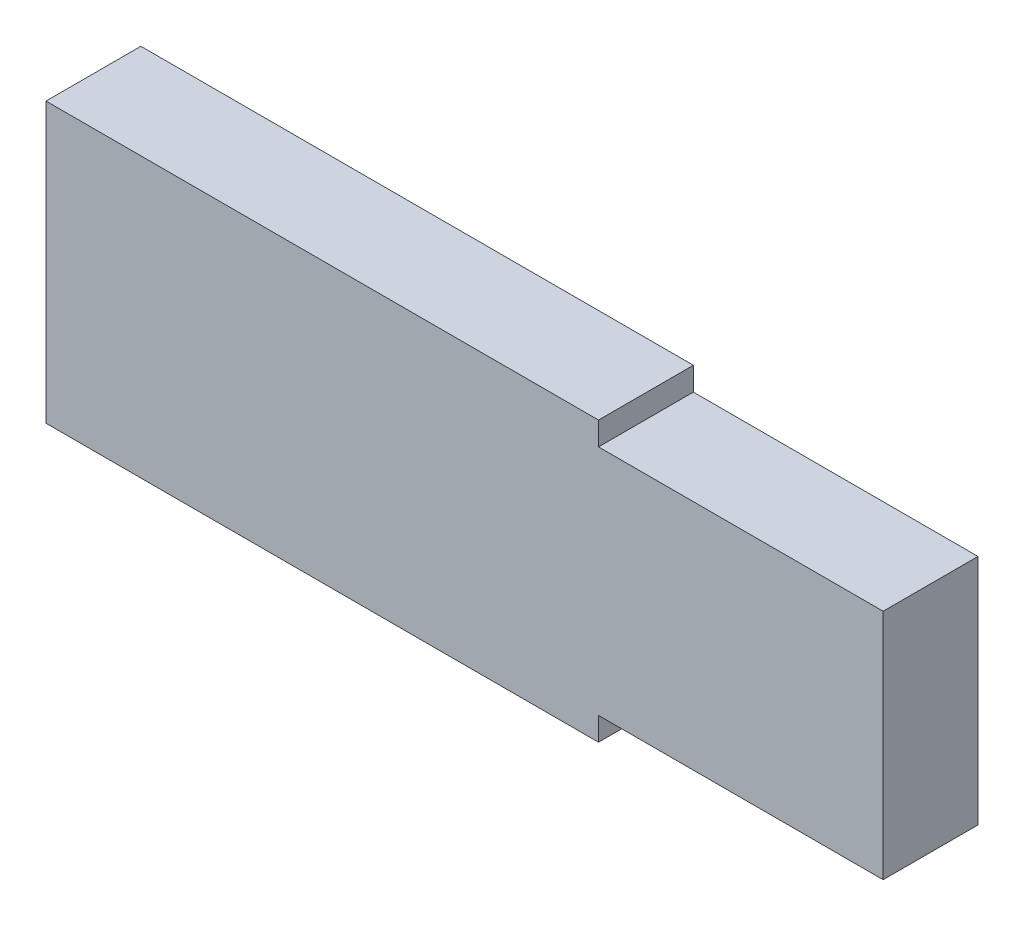
ISO-10303-21;
HEADER;
FILE_DESCRIPTION(('STEP AP214'),'2;1');
FILE_NAME('part.step','',(''),(''),'','','');
FILE_SCHEMA(('AUTOMOTIVE_DESIGN { 1 0 10303 214 1 1 1 1 }'));
ENDSEC;
DATA;
#1=APPLICATION_CONTEXT('core data for automotive mechanical design processes');
#2=APPLICATION_PROTOCOL_DEFINITION('international standard','automotive_design',2000,#1);
#3=PRODUCT_CONTEXT('',#1,'mechanical');
#4=PRODUCT('Part','Part','',(#3));
#5=PRODUCT_RELATED_PRODUCT_CATEGORY('part','',(#4));
#6=PRODUCT_DEFINITION_FORMATION('','',#4);
#7=PRODUCT_DEFINITION_CONTEXT('part definition',#1,'design');
#8=PRODUCT_DEFINITION('design','',#6,#7);
#9=PRODUCT_DEFINITION_SHAPE('','',#8);
#10=(LENGTH_UNIT() NAMED_UNIT(*) SI_UNIT(.MILLI.,.METRE.));
#11=(NAMED_UNIT(*) PLANE_ANGLE_UNIT() SI_UNIT($,.RADIAN.));
#12=(NAMED_UNIT(*) SI_UNIT($,.STERADIAN.) SOLID_ANGLE_UNIT());
#13=UNCERTAINTY_MEASURE_WITH_UNIT(LENGTH_MEASURE(1.E-05),#10,'distance_accuracy_value','');
#14=(GEOMETRIC_REPRESENTATION_CONTEXT(3) GLOBAL_UNCERTAINTY_ASSIGNED_CONTEXT((#13)) GLOBAL_UNIT_ASSIGNED_CONTEXT((#10,
#11,#12)) REPRESENTATION_CONTEXT('',''));
#15=CARTESIAN_POINT('',(0.,0.,0.));
#16=DIRECTION('',(0.,0.,1.));
#17=DIRECTION('',(1.,0.,0.));
#18=AXIS2_PLACEMENT_3D('',#15,#16,#17);
#19=CARTESIAN_POINT('',(80.,-7.49999999999999,5.1));
#20=DIRECTION('',(-1.,0.,0.));
#21=DIRECTION('',(0.,0.,1.));
#22=AXIS2_PLACEMENT_3D('',#19,#20,#21);
#23=PLANE('',#22);
#24=DIRECTION('',(0.,1.,0.));
#25=VECTOR('',#24,1.);
#26=CARTESIAN_POINT('',(80.,-7.49999999999999,0.));
#27=LINE('',#26,#25);
#28=CARTESIAN_POINT('',(80.,-7.49999999999999,0.));
#29=VERTEX_POINT('',#28);
#30=CARTESIAN_POINT('',(80.,-6.25,0.));
#31=VERTEX_POINT('',#30);
#32=EDGE_CURVE('E129',#29,#31,#27,.T.);
#33=ORIENTED_EDGE('',*,*,#32,.T.);
#34=DIRECTION('',(0.,0.,-1.));
#35=VECTOR('',#34,1.);
#36=CARTESIAN_POINT('',(80.,-6.25,5.1));
#37=LINE('',#36,#35);
#38=CARTESIAN_POINT('',(80.,-6.25,5.1));
#39=VERTEX_POINT('',#38);
#40=EDGE_CURVE('E11',#39,#31,#37,.T.);
#41=ORIENTED_EDGE('',*,*,#40,.F.);
#42=DIRECTION('',(0.,1.,0.));
#43=VECTOR('',#42,1.);
#44=CARTESIAN_POINT('',(80.,-7.49999999999999,5.1));
#45=LINE('',#44,#43);
#46=CARTESIAN_POINT('',(80.,-7.49999999999999,5.1));
#47=VERTEX_POINT('',#46);
#48=EDGE_CURVE('E143',#47,#39,#45,.T.);
#49=ORIENTED_EDGE('',*,*,#48,.F.);
#50=DIRECTION('',(0.,0.,-1.));
#51=VECTOR('',#50,1.);
#52=CARTESIAN_POINT('',(80.,-7.49999999999999,5.1));
#53=LINE('',#52,#51);
#54=EDGE_CURVE('E125',#47,#29,#53,.T.);
#55=ORIENTED_EDGE('',*,*,#54,.T.);
#56=EDGE_LOOP('',(#33,#41,#49,#55));
#57=FACE_BOUND('',#56,.T.);
#58=ADVANCED_FACE('F33',(#57),#23,.F.);
#59=CARTESIAN_POINT('',(80.,-6.25,5.1));
#60=DIRECTION('',(0.,1.,0.));
#61=DIRECTION('',(0.,0.,1.));
#62=AXIS2_PLACEMENT_3D('',#59,#60,#61);
#63=PLANE('',#62);
#64=DIRECTION('',(1.,0.,0.));
#65=VECTOR('',#64,1.);
#66=CARTESIAN_POINT('',(80.,-6.25,0.));
#67=LINE('',#66,#65);
#68=CARTESIAN_POINT('',(95.3,-6.25,0.));
#69=VERTEX_POINT('',#68);
#70=EDGE_CURVE('E132',#31,#69,#67,.T.);
#71=ORIENTED_EDGE('',*,*,#70,.T.);
#72=DIRECTION('',(0.,0.,-1.));
#73=VECTOR('',#72,1.);
#74=CARTESIAN_POINT('',(95.3,-6.25,5.1));
#75=LINE('',#74,#73);
#76=CARTESIAN_POINT('',(95.3,-6.25,5.1));
#77=VERTEX_POINT('',#76);
#78=EDGE_CURVE('E41',#77,#69,#75,.T.);
#79=ORIENTED_EDGE('',*,*,#78,.F.);
#80=DIRECTION('',(1.,0.,0.));
#81=VECTOR('',#80,1.);
#82=CARTESIAN_POINT('',(80.,-6.25,5.1));
#83=LINE('',#82,#81);
#84=EDGE_CURVE('E92',#39,#77,#83,.T.);
#85=ORIENTED_EDGE('',*,*,#84,.F.);
#86=ORIENTED_EDGE('',*,*,#40,.T.);
#87=EDGE_LOOP('',(#71,#79,#85,#86));
#88=FACE_BOUND('',#87,.T.);
#89=ADVANCED_FACE('F178',(#88),#63,.F.);
#90=CARTESIAN_POINT('',(95.3,6.25,5.1));
#91=DIRECTION('',(-1.,0.,0.));
#92=DIRECTION('',(0.,0.,1.));
#93=AXIS2_PLACEMENT_3D('',#90,#91,#92);
#94=PLANE('',#93);
#95=DIRECTION('',(0.,1.,0.));
#96=VECTOR('',#95,1.);
#97=CARTESIAN_POINT('',(95.3,6.25,0.));
#98=LINE('',#97,#96);
#99=CARTESIAN_POINT('',(95.3,6.25,0.));
#100=VERTEX_POINT('',#99);
#101=EDGE_CURVE('E134',#69,#100,#98,.T.);
#102=ORIENTED_EDGE('',*,*,#101,.T.);
#103=DIRECTION('',(0.,0.,-1.));
#104=VECTOR('',#103,1.);
#105=CARTESIAN_POINT('',(95.3,6.25,5.1));
#106=LINE('',#105,#104);
#107=CARTESIAN_POINT('',(95.3,6.25,5.1));
#108=VERTEX_POINT('',#107);
#109=EDGE_CURVE('E150',#108,#100,#106,.T.);
#110=ORIENTED_EDGE('',*,*,#109,.F.);
#111=DIRECTION('',(0.,1.,0.));
#112=VECTOR('',#111,1.);
#113=CARTESIAN_POINT('',(95.3,6.25,5.1));
#114=LINE('',#113,#112);
#115=EDGE_CURVE('E158',#77,#108,#114,.T.);
#116=ORIENTED_EDGE('',*,*,#115,.F.);
#117=ORIENTED_EDGE('',*,*,#78,.T.);
#118=EDGE_LOOP('',(#102,#110,#116,#117));
#119=FACE_BOUND('',#118,.T.);
#120=ADVANCED_FACE('F156',(#119),#94,.F.);
#121=CARTESIAN_POINT('',(80.,6.25,5.1));
#122=DIRECTION('',(0.,-1.,0.));
#123=DIRECTION('',(0.,0.,-1.));
#124=AXIS2_PLACEMENT_3D('',#121,#122,#123);
#125=PLANE('',#124);
#126=DIRECTION('',(-1.,0.,0.));
#127=VECTOR('',#126,1.);
#128=CARTESIAN_POINT('',(80.,6.25,0.));
#129=LINE('',#128,#127);
#130=CARTESIAN_POINT('',(80.,6.25,0.));
#131=VERTEX_POINT('',#130);
#132=EDGE_CURVE('E136',#100,#131,#129,.T.);
#133=ORIENTED_EDGE('',*,*,#132,.T.);
#134=DIRECTION('',(0.,0.,-1.));
#135=VECTOR('',#134,1.);
#136=CARTESIAN_POINT('',(80.,6.25,5.1));
#137=LINE('',#136,#135);
#138=CARTESIAN_POINT('',(80.,6.25,5.1));
#139=VERTEX_POINT('',#138);
#140=EDGE_CURVE('E147',#139,#131,#137,.T.);
#141=ORIENTED_EDGE('',*,*,#140,.F.);
#142=DIRECTION('',(-1.,0.,0.));
#143=VECTOR('',#142,1.);
#144=CARTESIAN_POINT('',(80.,6.25,5.1));
#145=LINE('',#144,#143);
#146=EDGE_CURVE('E170',#108,#139,#145,.T.);
#147=ORIENTED_EDGE('',*,*,#146,.F.);
#148=ORIENTED_EDGE('',*,*,#109,.T.);
#149=EDGE_LOOP('',(#133,#141,#147,#148));
#150=FACE_BOUND('',#149,.T.);
#151=ADVANCED_FACE('F166',(#150),#125,.F.);
#152=CARTESIAN_POINT('',(80.,6.25,5.1));
#153=DIRECTION('',(-1.,0.,0.));
#154=DIRECTION('',(0.,0.,1.));
#155=AXIS2_PLACEMENT_3D('',#152,#153,#154);
#156=PLANE('',#155);
#157=DIRECTION('',(0.,1.,0.));
#158=VECTOR('',#157,1.);
#159=CARTESIAN_POINT('',(80.,6.25,0.));
#160=LINE('',#159,#158);
#161=CARTESIAN_POINT('',(80.,7.50000000000001,0.));
#162=VERTEX_POINT('',#161);
#163=EDGE_CURVE('E138',#131,#162,#160,.T.);
#164=ORIENTED_EDGE('',*,*,#163,.T.);
#165=DIRECTION('',(0.,0.,-1.));
#166=VECTOR('',#165,1.);
#167=CARTESIAN_POINT('',(80.,7.50000000000001,5.1));
#168=LINE('',#167,#166);
#169=CARTESIAN_POINT('',(80.,7.50000000000001,5.1));
#170=VERTEX_POINT('',#169);
#171=EDGE_CURVE('E120',#170,#162,#168,.T.);
#172=ORIENTED_EDGE('',*,*,#171,.F.);
#173=DIRECTION('',(0.,1.,0.));
#174=VECTOR('',#173,1.);
#175=CARTESIAN_POINT('',(80.,6.25,5.1));
#176=LINE('',#175,#174);
#177=EDGE_CURVE('E111',#139,#170,#176,.T.);
#178=ORIENTED_EDGE('',*,*,#177,.F.);
#179=ORIENTED_EDGE('',*,*,#140,.T.);
#180=EDGE_LOOP('',(#164,#172,#178,#179));
#181=FACE_BOUND('',#180,.T.);
#182=ADVANCED_FACE('F169',(#181),#156,.F.);
#183=CARTESIAN_POINT('',(80.,7.50000000000001,5.1));
#184=DIRECTION('',(0.,-1.,0.));
#185=DIRECTION('',(1.,0.,0.));
#186=AXIS2_PLACEMENT_3D('',#183,#184,#185);
#187=PLANE('',#186);
#188=DIRECTION('',(-1.,0.,0.));
#189=VECTOR('',#188,1.);
#190=CARTESIAN_POINT('',(80.,7.50000000000001,0.));
#191=LINE('',#190,#189);
#192=CARTESIAN_POINT('',(50.3,7.50000000000001,0.));
#193=VERTEX_POINT('',#192);
#194=EDGE_CURVE('E119',#162,#193,#191,.T.);
#195=ORIENTED_EDGE('',*,*,#194,.T.);
#196=DIRECTION('',(0.,0.,-1.));
#197=VECTOR('',#196,1.);
#198=CARTESIAN_POINT('',(50.3,7.50000000000001,5.1));
#199=LINE('',#198,#197);
#200=CARTESIAN_POINT('',(50.3,7.50000000000001,5.1));
#201=VERTEX_POINT('',#200);
#202=EDGE_CURVE('E116',#201,#193,#199,.T.);
#203=ORIENTED_EDGE('',*,*,#202,.F.);
#204=DIRECTION('',(-1.,0.,0.));
#205=VECTOR('',#204,1.);
#206=CARTESIAN_POINT('',(80.,7.50000000000001,5.1));
#207=LINE('',#206,#205);
#208=EDGE_CURVE('E105',#170,#201,#207,.T.);
#209=ORIENTED_EDGE('',*,*,#208,.F.);
#210=ORIENTED_EDGE('',*,*,#171,.T.);
#211=EDGE_LOOP('',(#195,#203,#209,#210));
#212=FACE_BOUND('',#211,.T.);
#213=ADVANCED_FACE('F117',(#212),#187,.F.);
#214=CARTESIAN_POINT('',(50.3,7.50000000000001,5.1));
#215=DIRECTION('',(1.,0.,0.));
#216=DIRECTION('',(0.,0.,-1.));
#217=AXIS2_PLACEMENT_3D('',#214,#215,#216);
#218=PLANE('',#217);
#219=DIRECTION('',(0.,-1.,0.));
#220=VECTOR('',#219,1.);
#221=CARTESIAN_POINT('',(50.3,7.50000000000001,0.));
#222=LINE('',#221,#220);
#223=CARTESIAN_POINT('',(50.3,-7.49999999999999,0.));
#224=VERTEX_POINT('',#223);
#225=EDGE_CURVE('E78',#193,#224,#222,.T.);
#226=ORIENTED_EDGE('',*,*,#225,.T.);
#227=DIRECTION('',(0.,0.,-1.));
#228=VECTOR('',#227,1.);
#229=CARTESIAN_POINT('',(50.3,-7.49999999999999,5.1));
#230=LINE('',#229,#228);
#231=CARTESIAN_POINT('',(50.3,-7.49999999999999,5.1));
#232=VERTEX_POINT('',#231);
#233=EDGE_CURVE('E121',#232,#224,#230,.T.);
#234=ORIENTED_EDGE('',*,*,#233,.F.);
#235=DIRECTION('',(0.,-1.,0.));
#236=VECTOR('',#235,1.);
#237=CARTESIAN_POINT('',(50.3,7.50000000000001,5.1));
#238=LINE('',#237,#236);
#239=EDGE_CURVE('E109',#201,#232,#238,.T.);
#240=ORIENTED_EDGE('',*,*,#239,.F.);
#241=ORIENTED_EDGE('',*,*,#202,.T.);
#242=EDGE_LOOP('',(#226,#234,#240,#241));
#243=FACE_BOUND('',#242,.T.);
#244=ADVANCED_FACE('F123',(#243),#218,.F.);
#245=CARTESIAN_POINT('',(80.,-7.49999999999999,5.1));
#246=DIRECTION('',(0.,1.,0.));
#247=DIRECTION('',(-1.,0.,0.));
#248=AXIS2_PLACEMENT_3D('',#245,#246,#247);
#249=PLANE('',#248);
#250=DIRECTION('',(1.,0.,0.));
#251=VECTOR('',#250,1.);
#252=CARTESIAN_POINT('',(80.,-7.49999999999999,0.));
#253=LINE('',#252,#251);
#254=EDGE_CURVE('E84',#224,#29,#253,.T.);
#255=ORIENTED_EDGE('',*,*,#254,.T.);
#256=ORIENTED_EDGE('',*,*,#54,.F.);
#257=DIRECTION('',(1.,0.,0.));
#258=VECTOR('',#257,1.);
#259=CARTESIAN_POINT('',(80.,-7.49999999999999,5.1));
#260=LINE('',#259,#258);
#261=EDGE_CURVE('E49',#232,#47,#260,.T.);
#262=ORIENTED_EDGE('',*,*,#261,.F.);
#263=ORIENTED_EDGE('',*,*,#233,.T.);
#264=EDGE_LOOP('',(#255,#256,#262,#263));
#265=FACE_BOUND('',#264,.T.);
#266=ADVANCED_FACE('F194',(#265),#249,.F.);
#267=CARTESIAN_POINT('',(0.,0.,5.1));
#268=DIRECTION('',(0.,0.,-1.));
#269=DIRECTION('',(-1.,0.,0.));
#270=AXIS2_PLACEMENT_3D('',#267,#268,#269);
#271=PLANE('',#270);
#272=ORIENTED_EDGE('',*,*,#48,.T.);
#273=ORIENTED_EDGE('',*,*,#84,.T.);
#274=ORIENTED_EDGE('',*,*,#115,.T.);
#275=ORIENTED_EDGE('',*,*,#146,.T.);
#276=ORIENTED_EDGE('',*,*,#177,.T.);
#277=ORIENTED_EDGE('',*,*,#208,.T.);
#278=ORIENTED_EDGE('',*,*,#239,.T.);
#279=ORIENTED_EDGE('',*,*,#261,.T.);
#280=EDGE_LOOP('',(#272,#273,#274,#275,#276,#277,#278,#279));
#281=FACE_BOUND('',#280,.T.);
#282=ADVANCED_FACE('F107',(#281),#271,.F.);
#283=CARTESIAN_POINT('',(0.,0.,0.));
#284=DIRECTION('',(0.,0.,-1.));
#285=DIRECTION('',(-1.,0.,0.));
#286=AXIS2_PLACEMENT_3D('',#283,#284,#285);
#287=PLANE('',#286);
#288=ORIENTED_EDGE('',*,*,#32,.F.);
#289=ORIENTED_EDGE('',*,*,#254,.F.);
#290=ORIENTED_EDGE('',*,*,#225,.F.);
#291=ORIENTED_EDGE('',*,*,#194,.F.);
#292=ORIENTED_EDGE('',*,*,#163,.F.);
#293=ORIENTED_EDGE('',*,*,#132,.F.);
#294=ORIENTED_EDGE('',*,*,#101,.F.);
#295=ORIENTED_EDGE('',*,*,#70,.F.);
#296=EDGE_LOOP('',(#288,#289,#290,#291,#292,#293,#294,#295));
#297=FACE_BOUND('',#296,.T.);
#298=ADVANCED_FACE('F162',(#297),#287,.T.);
#299=CLOSED_SHELL('',(#58,#89,#120,#151,#182,#213,#244,#266,#282,#298));
#300=MANIFOLD_SOLID_BREP('B2',#299);
#301=ADVANCED_BREP_SHAPE_REPRESENTATION('',(#18,#300),#14);
#302=SHAPE_DEFINITION_REPRESENTATION(#9,#301);
ENDSEC;
END-ISO-10303-21;
